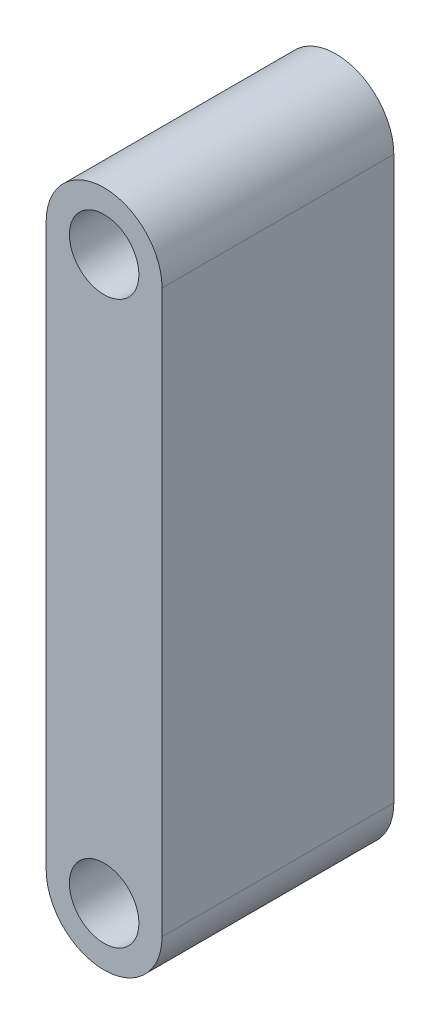
ISO-10303-21;
HEADER;
FILE_DESCRIPTION(('STEP AP214'),'2;1');
FILE_NAME('part.step','',(''),(''),'','','');
FILE_SCHEMA(('AUTOMOTIVE_DESIGN { 1 0 10303 214 1 1 1 1 }'));
ENDSEC;
DATA;
#1=APPLICATION_CONTEXT('core data for automotive mechanical design processes');
#2=APPLICATION_PROTOCOL_DEFINITION('international standard','automotive_design',2000,#1);
#3=PRODUCT_CONTEXT('',#1,'mechanical');
#4=PRODUCT('Part','Part','',(#3));
#5=PRODUCT_RELATED_PRODUCT_CATEGORY('part','',(#4));
#6=PRODUCT_DEFINITION_FORMATION('','',#4);
#7=PRODUCT_DEFINITION_CONTEXT('part definition',#1,'design');
#8=PRODUCT_DEFINITION('design','',#6,#7);
#9=PRODUCT_DEFINITION_SHAPE('','',#8);
#10=(LENGTH_UNIT() NAMED_UNIT(*) SI_UNIT(.MILLI.,.METRE.));
#11=(NAMED_UNIT(*) PLANE_ANGLE_UNIT() SI_UNIT($,.RADIAN.));
#12=(NAMED_UNIT(*) SI_UNIT($,.STERADIAN.) SOLID_ANGLE_UNIT());
#13=UNCERTAINTY_MEASURE_WITH_UNIT(LENGTH_MEASURE(1.E-05),#10,'distance_accuracy_value','');
#14=(GEOMETRIC_REPRESENTATION_CONTEXT(3) GLOBAL_UNCERTAINTY_ASSIGNED_CONTEXT((#13)) GLOBAL_UNIT_ASSIGNED_CONTEXT((#10,
#11,#12)) REPRESENTATION_CONTEXT('',''));
#15=CARTESIAN_POINT('',(0.,0.,0.));
#16=DIRECTION('',(0.,0.,1.));
#17=DIRECTION('',(1.,0.,0.));
#18=AXIS2_PLACEMENT_3D('',#15,#16,#17);
#19=CARTESIAN_POINT('',(0.,202.756382451077,50.));
#20=DIRECTION('',(0.,0.,1.));
#21=DIRECTION('',(1.,0.,0.));
#22=AXIS2_PLACEMENT_3D('',#19,#20,#21);
#23=PLANE('',#22);
#24=CARTESIAN_POINT('',(0.,202.756382451077,50.));
#25=DIRECTION('',(0.,0.,1.));
#26=DIRECTION('',(1.,0.,0.));
#27=AXIS2_PLACEMENT_3D('',#24,#25,#26);
#28=CIRCLE('',#27,15.);
#29=CARTESIAN_POINT('',(15.,202.756382451077,50.));
#30=VERTEX_POINT('',#29);
#31=EDGE_CURVE('E112',#30,#30,#28,.T.);
#32=ORIENTED_EDGE('',*,*,#31,.F.);
#33=EDGE_LOOP('',(#32));
#34=FACE_BOUND('',#33,.T.);
#35=CARTESIAN_POINT('',(0.,202.756382451077,50.));
#36=DIRECTION('',(0.,0.,1.));
#37=DIRECTION('',(1.,0.,0.));
#38=AXIS2_PLACEMENT_3D('',#35,#36,#37);
#39=CIRCLE('',#38,25.);
#40=CARTESIAN_POINT('',(25.,202.756382451077,50.));
#41=VERTEX_POINT('',#40);
#42=CARTESIAN_POINT('',(-25.,202.756382451077,50.));
#43=VERTEX_POINT('',#42);
#44=EDGE_CURVE('E92',#41,#43,#39,.T.);
#45=ORIENTED_EDGE('',*,*,#44,.T.);
#46=DIRECTION('',(0.,-1.,0.));
#47=VECTOR('',#46,1.);
#48=CARTESIAN_POINT('',(-25.,202.756382451077,50.));
#49=LINE('',#48,#47);
#50=CARTESIAN_POINT('',(-25.,-39.6436175489231,50.));
#51=VERTEX_POINT('',#50);
#52=EDGE_CURVE('E87',#43,#51,#49,.T.);
#53=ORIENTED_EDGE('',*,*,#52,.T.);
#54=CARTESIAN_POINT('',(0.,-39.6436175489231,50.));
#55=DIRECTION('',(0.,0.,1.));
#56=DIRECTION('',(1.,0.,0.));
#57=AXIS2_PLACEMENT_3D('',#54,#55,#56);
#58=CIRCLE('',#57,25.);
#59=CARTESIAN_POINT('',(25.,-39.6436175489231,50.));
#60=VERTEX_POINT('',#59);
#61=EDGE_CURVE('E90',#51,#60,#58,.T.);
#62=ORIENTED_EDGE('',*,*,#61,.T.);
#63=DIRECTION('',(0.,1.,0.));
#64=VECTOR('',#63,1.);
#65=CARTESIAN_POINT('',(25.,202.756382451077,50.));
#66=LINE('',#65,#64);
#67=EDGE_CURVE('E57',#60,#41,#66,.T.);
#68=ORIENTED_EDGE('',*,*,#67,.T.);
#69=EDGE_LOOP('',(#45,#53,#62,#68));
#70=FACE_BOUND('',#69,.T.);
#71=CARTESIAN_POINT('',(0.,-39.6436175489231,50.));
#72=DIRECTION('',(0.,0.,1.));
#73=DIRECTION('',(1.,0.,0.));
#74=AXIS2_PLACEMENT_3D('',#71,#72,#73);
#75=CIRCLE('',#74,15.);
#76=CARTESIAN_POINT('',(15.,-39.6436175489231,50.));
#77=VERTEX_POINT('',#76);
#78=EDGE_CURVE('E134',#77,#77,#75,.T.);
#79=ORIENTED_EDGE('',*,*,#78,.F.);
#80=EDGE_LOOP('',(#79));
#81=FACE_BOUND('',#80,.T.);
#82=ADVANCED_FACE('F39',(#34,#70,#81),#23,.T.);
#83=CARTESIAN_POINT('',(0.,202.756382451077,-50.));
#84=DIRECTION('',(0.,0.,1.));
#85=DIRECTION('',(1.,0.,0.));
#86=AXIS2_PLACEMENT_3D('',#83,#84,#85);
#87=PLANE('',#86);
#88=CARTESIAN_POINT('',(0.,202.756382451077,-50.));
#89=DIRECTION('',(0.,0.,1.));
#90=DIRECTION('',(1.,0.,0.));
#91=AXIS2_PLACEMENT_3D('',#88,#89,#90);
#92=CIRCLE('',#91,25.);
#93=CARTESIAN_POINT('',(25.,202.756382451077,-50.));
#94=VERTEX_POINT('',#93);
#95=CARTESIAN_POINT('',(-25.,202.756382451077,-50.));
#96=VERTEX_POINT('',#95);
#97=EDGE_CURVE('E108',#94,#96,#92,.T.);
#98=ORIENTED_EDGE('',*,*,#97,.F.);
#99=DIRECTION('',(0.,1.,0.));
#100=VECTOR('',#99,1.);
#101=CARTESIAN_POINT('',(25.,202.756382451077,-50.));
#102=LINE('',#101,#100);
#103=CARTESIAN_POINT('',(25.,-39.6436175489231,-50.));
#104=VERTEX_POINT('',#103);
#105=EDGE_CURVE('E80',#104,#94,#102,.T.);
#106=ORIENTED_EDGE('',*,*,#105,.F.);
#107=CARTESIAN_POINT('',(0.,-39.6436175489231,-50.));
#108=DIRECTION('',(0.,0.,1.));
#109=DIRECTION('',(1.,0.,0.));
#110=AXIS2_PLACEMENT_3D('',#107,#108,#109);
#111=CIRCLE('',#110,25.);
#112=CARTESIAN_POINT('',(-25.,-39.6436175489231,-50.));
#113=VERTEX_POINT('',#112);
#114=EDGE_CURVE('E74',#113,#104,#111,.T.);
#115=ORIENTED_EDGE('',*,*,#114,.F.);
#116=DIRECTION('',(0.,-1.,0.));
#117=VECTOR('',#116,1.);
#118=CARTESIAN_POINT('',(-25.,202.756382451077,-50.));
#119=LINE('',#118,#117);
#120=EDGE_CURVE('E97',#96,#113,#119,.T.);
#121=ORIENTED_EDGE('',*,*,#120,.F.);
#122=EDGE_LOOP('',(#98,#106,#115,#121));
#123=FACE_BOUND('',#122,.T.);
#124=CARTESIAN_POINT('',(0.,202.756382451077,-50.));
#125=DIRECTION('',(0.,0.,1.));
#126=DIRECTION('',(1.,0.,0.));
#127=AXIS2_PLACEMENT_3D('',#124,#125,#126);
#128=CIRCLE('',#127,15.);
#129=CARTESIAN_POINT('',(15.,202.756382451077,-50.));
#130=VERTEX_POINT('',#129);
#131=EDGE_CURVE('E130',#130,#130,#128,.T.);
#132=ORIENTED_EDGE('',*,*,#131,.T.);
#133=EDGE_LOOP('',(#132));
#134=FACE_BOUND('',#133,.T.);
#135=CARTESIAN_POINT('',(0.,-39.6436175489231,-50.));
#136=DIRECTION('',(0.,0.,1.));
#137=DIRECTION('',(1.,0.,0.));
#138=AXIS2_PLACEMENT_3D('',#135,#136,#137);
#139=CIRCLE('',#138,15.);
#140=CARTESIAN_POINT('',(15.,-39.6436175489231,-50.));
#141=VERTEX_POINT('',#140);
#142=EDGE_CURVE('E138',#141,#141,#139,.T.);
#143=ORIENTED_EDGE('',*,*,#142,.T.);
#144=EDGE_LOOP('',(#143));
#145=FACE_BOUND('',#144,.T.);
#146=ADVANCED_FACE('F125',(#123,#134,#145),#87,.F.);
#147=CARTESIAN_POINT('',(0.,202.756382451077,50.));
#148=DIRECTION('',(0.,0.,-1.));
#149=DIRECTION('',(-1.,0.,0.));
#150=AXIS2_PLACEMENT_3D('',#147,#148,#149);
#151=CYLINDRICAL_SURFACE('',#150,25.);
#152=ORIENTED_EDGE('',*,*,#97,.T.);
#153=DIRECTION('',(0.,0.,-1.));
#154=VECTOR('',#153,1.);
#155=CARTESIAN_POINT('',(-25.,202.756382451077,50.));
#156=LINE('',#155,#154);
#157=EDGE_CURVE('E11',#43,#96,#156,.T.);
#158=ORIENTED_EDGE('',*,*,#157,.F.);
#159=ORIENTED_EDGE('',*,*,#44,.F.);
#160=DIRECTION('',(0.,0.,-1.));
#161=VECTOR('',#160,1.);
#162=CARTESIAN_POINT('',(25.,202.756382451077,50.));
#163=LINE('',#162,#161);
#164=EDGE_CURVE('E104',#41,#94,#163,.T.);
#165=ORIENTED_EDGE('',*,*,#164,.T.);
#166=EDGE_LOOP('',(#152,#158,#159,#165));
#167=FACE_BOUND('',#166,.T.);
#168=ADVANCED_FACE('F41',(#167),#151,.T.);
#169=CARTESIAN_POINT('',(-25.,202.756382451077,50.));
#170=DIRECTION('',(1.,0.,0.));
#171=DIRECTION('',(0.,1.,0.));
#172=AXIS2_PLACEMENT_3D('',#169,#170,#171);
#173=PLANE('',#172);
#174=ORIENTED_EDGE('',*,*,#120,.T.);
#175=DIRECTION('',(0.,0.,-1.));
#176=VECTOR('',#175,1.);
#177=CARTESIAN_POINT('',(-25.,-39.6436175489231,50.));
#178=LINE('',#177,#176);
#179=EDGE_CURVE('E49',#51,#113,#178,.T.);
#180=ORIENTED_EDGE('',*,*,#179,.F.);
#181=ORIENTED_EDGE('',*,*,#52,.F.);
#182=ORIENTED_EDGE('',*,*,#157,.T.);
#183=EDGE_LOOP('',(#174,#180,#181,#182));
#184=FACE_BOUND('',#183,.T.);
#185=ADVANCED_FACE('F96',(#184),#173,.F.);
#186=CARTESIAN_POINT('',(0.,-39.6436175489231,50.));
#187=DIRECTION('',(0.,0.,-1.));
#188=DIRECTION('',(-1.,0.,0.));
#189=AXIS2_PLACEMENT_3D('',#186,#187,#188);
#190=CYLINDRICAL_SURFACE('',#189,25.);
#191=ORIENTED_EDGE('',*,*,#114,.T.);
#192=DIRECTION('',(0.,0.,-1.));
#193=VECTOR('',#192,1.);
#194=CARTESIAN_POINT('',(25.,-39.6436175489231,50.));
#195=LINE('',#194,#193);
#196=EDGE_CURVE('E99',#60,#104,#195,.T.);
#197=ORIENTED_EDGE('',*,*,#196,.F.);
#198=ORIENTED_EDGE('',*,*,#61,.F.);
#199=ORIENTED_EDGE('',*,*,#179,.T.);
#200=EDGE_LOOP('',(#191,#197,#198,#199));
#201=FACE_BOUND('',#200,.T.);
#202=ADVANCED_FACE('F100',(#201),#190,.T.);
#203=CARTESIAN_POINT('',(25.,202.756382451077,50.));
#204=DIRECTION('',(-1.,0.,0.));
#205=DIRECTION('',(0.,-1.,0.));
#206=AXIS2_PLACEMENT_3D('',#203,#204,#205);
#207=PLANE('',#206);
#208=ORIENTED_EDGE('',*,*,#105,.T.);
#209=ORIENTED_EDGE('',*,*,#164,.F.);
#210=ORIENTED_EDGE('',*,*,#67,.F.);
#211=ORIENTED_EDGE('',*,*,#196,.T.);
#212=EDGE_LOOP('',(#208,#209,#210,#211));
#213=FACE_BOUND('',#212,.T.);
#214=ADVANCED_FACE('F122',(#213),#207,.F.);
#215=CARTESIAN_POINT('',(0.,202.756382451077,50.));
#216=DIRECTION('',(0.,0.,-1.));
#217=DIRECTION('',(-1.,0.,0.));
#218=AXIS2_PLACEMENT_3D('',#215,#216,#217);
#219=CYLINDRICAL_SURFACE('',#218,15.);
#220=ORIENTED_EDGE('',*,*,#31,.T.);
#221=EDGE_LOOP('',(#220));
#222=FACE_BOUND('',#221,.T.);
#223=ORIENTED_EDGE('',*,*,#131,.F.);
#224=EDGE_LOOP('',(#223));
#225=FACE_BOUND('',#224,.T.);
#226=ADVANCED_FACE('F157',(#222,#225),#219,.F.);
#227=CARTESIAN_POINT('',(0.,-39.6436175489231,50.));
#228=DIRECTION('',(0.,0.,-1.));
#229=DIRECTION('',(-1.,0.,0.));
#230=AXIS2_PLACEMENT_3D('',#227,#228,#229);
#231=CYLINDRICAL_SURFACE('',#230,15.);
#232=ORIENTED_EDGE('',*,*,#78,.T.);
#233=EDGE_LOOP('',(#232));
#234=FACE_BOUND('',#233,.T.);
#235=ORIENTED_EDGE('',*,*,#142,.F.);
#236=EDGE_LOOP('',(#235));
#237=FACE_BOUND('',#236,.T.);
#238=ADVANCED_FACE('F146',(#234,#237),#231,.F.);
#239=CLOSED_SHELL('',(#82,#146,#168,#185,#202,#214,#226,#238));
#240=MANIFOLD_SOLID_BREP('B2',#239);
#241=ADVANCED_BREP_SHAPE_REPRESENTATION('',(#18,#240),#14);
#242=SHAPE_DEFINITION_REPRESENTATION(#9,#241);
ENDSEC;
END-ISO-10303-21;
